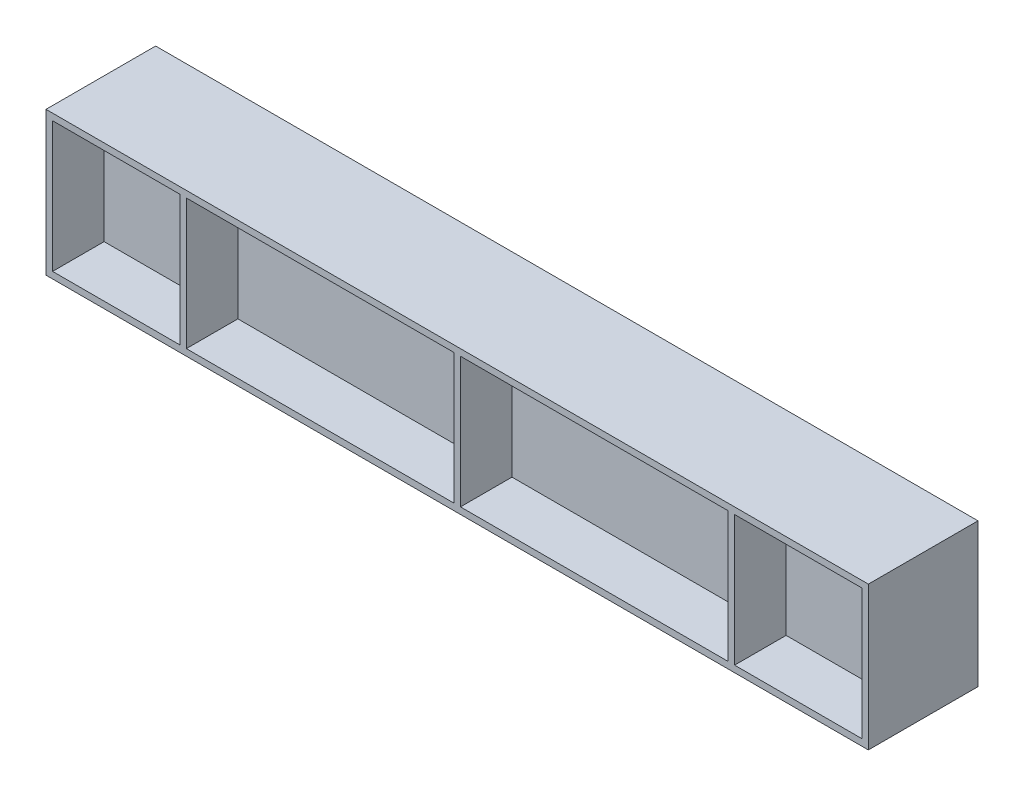
ISO-10303-21;
HEADER;
FILE_DESCRIPTION(('STEP AP214'),'2;1');
FILE_NAME('part.step','',(''),(''),'','','');
FILE_SCHEMA(('AUTOMOTIVE_DESIGN { 1 0 10303 214 1 1 1 1 }'));
ENDSEC;
DATA;
#1=APPLICATION_CONTEXT('core data for automotive mechanical design processes');
#2=APPLICATION_PROTOCOL_DEFINITION('international standard','automotive_design',2000,#1);
#3=PRODUCT_CONTEXT('',#1,'mechanical');
#4=PRODUCT('Part','Part','',(#3));
#5=PRODUCT_RELATED_PRODUCT_CATEGORY('part','',(#4));
#6=PRODUCT_DEFINITION_FORMATION('','',#4);
#7=PRODUCT_DEFINITION_CONTEXT('part definition',#1,'design');
#8=PRODUCT_DEFINITION('design','',#6,#7);
#9=PRODUCT_DEFINITION_SHAPE('','',#8);
#10=(LENGTH_UNIT() NAMED_UNIT(*) SI_UNIT(.MILLI.,.METRE.));
#11=(NAMED_UNIT(*) PLANE_ANGLE_UNIT() SI_UNIT($,.RADIAN.));
#12=(NAMED_UNIT(*) SI_UNIT($,.STERADIAN.) SOLID_ANGLE_UNIT());
#13=UNCERTAINTY_MEASURE_WITH_UNIT(LENGTH_MEASURE(1.E-05),#10,'distance_accuracy_value','');
#14=(GEOMETRIC_REPRESENTATION_CONTEXT(3) GLOBAL_UNCERTAINTY_ASSIGNED_CONTEXT((#13)) GLOBAL_UNIT_ASSIGNED_CONTEXT((#10,
#11,#12)) REPRESENTATION_CONTEXT('',''));
#15=CARTESIAN_POINT('',(0.,0.,0.));
#16=DIRECTION('',(0.,0.,1.));
#17=DIRECTION('',(1.,0.,0.));
#18=AXIS2_PLACEMENT_3D('',#15,#16,#17);
#19=CARTESIAN_POINT('',(12.,250.,0.));
#20=DIRECTION('',(-1.,0.,0.));
#21=DIRECTION('',(0.,-1.,0.));
#22=AXIS2_PLACEMENT_3D('',#19,#20,#21);
#23=PLANE('',#22);
#24=DIRECTION('',(0.,0.,1.));
#25=VECTOR('',#24,1.);
#26=CARTESIAN_POINT('',(12.,12.,0.));
#27=LINE('',#26,#25);
#28=CARTESIAN_POINT('',(12.,12.,106.));
#29=VERTEX_POINT('',#28);
#30=CARTESIAN_POINT('',(12.,12.,200.));
#31=VERTEX_POINT('',#30);
#32=EDGE_CURVE('E391',#29,#31,#27,.T.);
#33=ORIENTED_EDGE('',*,*,#32,.F.);
#34=DIRECTION('',(0.,1.,0.));
#35=VECTOR('',#34,1.);
#36=CARTESIAN_POINT('',(12.,250.,106.));
#37=LINE('',#36,#35);
#38=CARTESIAN_POINT('',(12.,250.,106.));
#39=VERTEX_POINT('',#38);
#40=EDGE_CURVE('E47',#29,#39,#37,.T.);
#41=ORIENTED_EDGE('',*,*,#40,.T.);
#42=DIRECTION('',(0.,0.,1.));
#43=VECTOR('',#42,1.);
#44=CARTESIAN_POINT('',(12.,250.,0.));
#45=LINE('',#44,#43);
#46=CARTESIAN_POINT('',(12.,250.,200.));
#47=VERTEX_POINT('',#46);
#48=EDGE_CURVE('E406',#39,#47,#45,.T.);
#49=ORIENTED_EDGE('',*,*,#48,.T.);
#50=DIRECTION('',(0.,-1.,0.));
#51=VECTOR('',#50,1.);
#52=CARTESIAN_POINT('',(12.,250.,200.));
#53=LINE('',#52,#51);
#54=EDGE_CURVE('E365',#47,#31,#53,.T.);
#55=ORIENTED_EDGE('',*,*,#54,.T.);
#56=EDGE_LOOP('',(#33,#41,#49,#55));
#57=FACE_BOUND('',#56,.T.);
#58=ADVANCED_FACE('F32',(#57),#23,.F.);
#59=CARTESIAN_POINT('',(12.,250.,0.));
#60=DIRECTION('',(0.,1.,0.));
#61=DIRECTION('',(0.,0.,1.));
#62=AXIS2_PLACEMENT_3D('',#59,#60,#61);
#63=PLANE('',#62);
#64=ORIENTED_EDGE('',*,*,#48,.F.);
#65=DIRECTION('',(1.,0.,0.));
#66=VECTOR('',#65,1.);
#67=CARTESIAN_POINT('',(12.,250.,106.));
#68=LINE('',#67,#66);
#69=CARTESIAN_POINT('',(244.,250.,106.));
#70=VERTEX_POINT('',#69);
#71=EDGE_CURVE('E549',#39,#70,#68,.T.);
#72=ORIENTED_EDGE('',*,*,#71,.T.);
#73=DIRECTION('',(0.,0.,1.));
#74=VECTOR('',#73,1.);
#75=CARTESIAN_POINT('',(244.,250.,0.));
#76=LINE('',#75,#74);
#77=CARTESIAN_POINT('',(244.,250.,200.));
#78=VERTEX_POINT('',#77);
#79=EDGE_CURVE('E410',#70,#78,#76,.T.);
#80=ORIENTED_EDGE('',*,*,#79,.T.);
#81=DIRECTION('',(-1.,0.,0.));
#82=VECTOR('',#81,1.);
#83=CARTESIAN_POINT('',(12.,250.,200.));
#84=LINE('',#83,#82);
#85=EDGE_CURVE('E382',#78,#47,#84,.T.);
#86=ORIENTED_EDGE('',*,*,#85,.T.);
#87=EDGE_LOOP('',(#64,#72,#80,#86));
#88=FACE_BOUND('',#87,.T.);
#89=ADVANCED_FACE('F481',(#88),#63,.F.);
#90=CARTESIAN_POINT('',(244.,250.,0.));
#91=DIRECTION('',(1.,0.,0.));
#92=DIRECTION('',(0.,1.,0.));
#93=AXIS2_PLACEMENT_3D('',#90,#91,#92);
#94=PLANE('',#93);
#95=ORIENTED_EDGE('',*,*,#79,.F.);
#96=DIRECTION('',(0.,-1.,0.));
#97=VECTOR('',#96,1.);
#98=CARTESIAN_POINT('',(244.,250.,106.));
#99=LINE('',#98,#97);
#100=CARTESIAN_POINT('',(244.,12.,106.));
#101=VERTEX_POINT('',#100);
#102=EDGE_CURVE('E546',#70,#101,#99,.T.);
#103=ORIENTED_EDGE('',*,*,#102,.T.);
#104=DIRECTION('',(0.,0.,1.));
#105=VECTOR('',#104,1.);
#106=CARTESIAN_POINT('',(244.,12.,0.));
#107=LINE('',#106,#105);
#108=CARTESIAN_POINT('',(244.,12.,200.));
#109=VERTEX_POINT('',#108);
#110=EDGE_CURVE('E414',#101,#109,#107,.T.);
#111=ORIENTED_EDGE('',*,*,#110,.T.);
#112=DIRECTION('',(0.,1.,0.));
#113=VECTOR('',#112,1.);
#114=CARTESIAN_POINT('',(244.,250.,200.));
#115=LINE('',#114,#113);
#116=EDGE_CURVE('E397',#109,#78,#115,.T.);
#117=ORIENTED_EDGE('',*,*,#116,.T.);
#118=EDGE_LOOP('',(#95,#103,#111,#117));
#119=FACE_BOUND('',#118,.T.);
#120=ADVANCED_FACE('F486',(#119),#94,.F.);
#121=CARTESIAN_POINT('',(12.,12.,0.));
#122=DIRECTION('',(0.,-1.,0.));
#123=DIRECTION('',(1.,0.,0.));
#124=AXIS2_PLACEMENT_3D('',#121,#122,#123);
#125=PLANE('',#124);
#126=ORIENTED_EDGE('',*,*,#110,.F.);
#127=DIRECTION('',(-1.,0.,0.));
#128=VECTOR('',#127,1.);
#129=CARTESIAN_POINT('',(12.,12.,106.));
#130=LINE('',#129,#128);
#131=EDGE_CURVE('E544',#101,#29,#130,.T.);
#132=ORIENTED_EDGE('',*,*,#131,.T.);
#133=ORIENTED_EDGE('',*,*,#32,.T.);
#134=DIRECTION('',(1.,0.,0.));
#135=VECTOR('',#134,1.);
#136=CARTESIAN_POINT('',(12.,12.,200.));
#137=LINE('',#136,#135);
#138=EDGE_CURVE('E394',#31,#109,#137,.T.);
#139=ORIENTED_EDGE('',*,*,#138,.T.);
#140=EDGE_LOOP('',(#126,#132,#133,#139));
#141=FACE_BOUND('',#140,.T.);
#142=ADVANCED_FACE('F622',(#141),#125,.F.);
#143=CARTESIAN_POINT('',(256.,250.,0.));
#144=DIRECTION('',(-1.,0.,0.));
#145=DIRECTION('',(0.,-1.,0.));
#146=AXIS2_PLACEMENT_3D('',#143,#144,#145);
#147=PLANE('',#146);
#148=DIRECTION('',(0.,0.,1.));
#149=VECTOR('',#148,1.);
#150=CARTESIAN_POINT('',(256.,12.,0.));
#151=LINE('',#150,#149);
#152=CARTESIAN_POINT('',(256.,12.,106.));
#153=VERTEX_POINT('',#152);
#154=CARTESIAN_POINT('',(256.,12.,200.));
#155=VERTEX_POINT('',#154);
#156=EDGE_CURVE('E351',#153,#155,#151,.T.);
#157=ORIENTED_EDGE('',*,*,#156,.F.);
#158=DIRECTION('',(0.,1.,0.));
#159=VECTOR('',#158,1.);
#160=CARTESIAN_POINT('',(256.,250.,106.));
#161=LINE('',#160,#159);
#162=CARTESIAN_POINT('',(256.,250.,106.));
#163=VERTEX_POINT('',#162);
#164=EDGE_CURVE('E541',#153,#163,#161,.T.);
#165=ORIENTED_EDGE('',*,*,#164,.T.);
#166=DIRECTION('',(0.,0.,1.));
#167=VECTOR('',#166,1.);
#168=CARTESIAN_POINT('',(256.,250.,0.));
#169=LINE('',#168,#167);
#170=CARTESIAN_POINT('',(256.,250.,200.));
#171=VERTEX_POINT('',#170);
#172=EDGE_CURVE('E366',#163,#171,#169,.T.);
#173=ORIENTED_EDGE('',*,*,#172,.T.);
#174=DIRECTION('',(0.,-1.,0.));
#175=VECTOR('',#174,1.);
#176=CARTESIAN_POINT('',(256.,250.,200.));
#177=LINE('',#176,#175);
#178=EDGE_CURVE('E325',#171,#155,#177,.T.);
#179=ORIENTED_EDGE('',*,*,#178,.T.);
#180=EDGE_LOOP('',(#157,#165,#173,#179));
#181=FACE_BOUND('',#180,.T.);
#182=ADVANCED_FACE('F628',(#181),#147,.F.);
#183=CARTESIAN_POINT('',(256.,250.,0.));
#184=DIRECTION('',(0.,1.,0.));
#185=DIRECTION('',(0.,0.,1.));
#186=AXIS2_PLACEMENT_3D('',#183,#184,#185);
#187=PLANE('',#186);
#188=ORIENTED_EDGE('',*,*,#172,.F.);
#189=DIRECTION('',(1.,0.,0.));
#190=VECTOR('',#189,1.);
#191=CARTESIAN_POINT('',(256.,250.,106.));
#192=LINE('',#191,#190);
#193=CARTESIAN_POINT('',(744.,250.,106.));
#194=VERTEX_POINT('',#193);
#195=EDGE_CURVE('E538',#163,#194,#192,.T.);
#196=ORIENTED_EDGE('',*,*,#195,.T.);
#197=DIRECTION('',(0.,0.,1.));
#198=VECTOR('',#197,1.);
#199=CARTESIAN_POINT('',(744.,250.,0.));
#200=LINE('',#199,#198);
#201=CARTESIAN_POINT('',(744.,250.,200.));
#202=VERTEX_POINT('',#201);
#203=EDGE_CURVE('E370',#194,#202,#200,.T.);
#204=ORIENTED_EDGE('',*,*,#203,.T.);
#205=DIRECTION('',(-1.,0.,0.));
#206=VECTOR('',#205,1.);
#207=CARTESIAN_POINT('',(256.,250.,200.));
#208=LINE('',#207,#206);
#209=EDGE_CURVE('E342',#202,#171,#208,.T.);
#210=ORIENTED_EDGE('',*,*,#209,.T.);
#211=EDGE_LOOP('',(#188,#196,#204,#210));
#212=FACE_BOUND('',#211,.T.);
#213=ADVANCED_FACE('F724',(#212),#187,.F.);
#214=CARTESIAN_POINT('',(744.,250.,0.));
#215=DIRECTION('',(1.,0.,0.));
#216=DIRECTION('',(0.,0.,-1.));
#217=AXIS2_PLACEMENT_3D('',#214,#215,#216);
#218=PLANE('',#217);
#219=ORIENTED_EDGE('',*,*,#203,.F.);
#220=DIRECTION('',(0.,-1.,0.));
#221=VECTOR('',#220,1.);
#222=CARTESIAN_POINT('',(744.,250.,106.));
#223=LINE('',#222,#221);
#224=CARTESIAN_POINT('',(744.,12.,106.));
#225=VERTEX_POINT('',#224);
#226=EDGE_CURVE('E535',#194,#225,#223,.T.);
#227=ORIENTED_EDGE('',*,*,#226,.T.);
#228=DIRECTION('',(0.,0.,1.));
#229=VECTOR('',#228,1.);
#230=CARTESIAN_POINT('',(744.,12.,0.));
#231=LINE('',#230,#229);
#232=CARTESIAN_POINT('',(744.,12.,200.));
#233=VERTEX_POINT('',#232);
#234=EDGE_CURVE('E374',#225,#233,#231,.T.);
#235=ORIENTED_EDGE('',*,*,#234,.T.);
#236=DIRECTION('',(0.,1.,0.));
#237=VECTOR('',#236,1.);
#238=CARTESIAN_POINT('',(744.,250.,200.));
#239=LINE('',#238,#237);
#240=EDGE_CURVE('E357',#233,#202,#239,.T.);
#241=ORIENTED_EDGE('',*,*,#240,.T.);
#242=EDGE_LOOP('',(#219,#227,#235,#241));
#243=FACE_BOUND('',#242,.T.);
#244=ADVANCED_FACE('F730',(#243),#218,.F.);
#245=CARTESIAN_POINT('',(256.,12.,0.));
#246=DIRECTION('',(0.,-1.,0.));
#247=DIRECTION('',(1.,0.,0.));
#248=AXIS2_PLACEMENT_3D('',#245,#246,#247);
#249=PLANE('',#248);
#250=ORIENTED_EDGE('',*,*,#234,.F.);
#251=DIRECTION('',(-1.,0.,0.));
#252=VECTOR('',#251,1.);
#253=CARTESIAN_POINT('',(256.,12.,106.));
#254=LINE('',#253,#252);
#255=EDGE_CURVE('E532',#225,#153,#254,.T.);
#256=ORIENTED_EDGE('',*,*,#255,.T.);
#257=ORIENTED_EDGE('',*,*,#156,.T.);
#258=DIRECTION('',(1.,0.,0.));
#259=VECTOR('',#258,1.);
#260=CARTESIAN_POINT('',(256.,12.,200.));
#261=LINE('',#260,#259);
#262=EDGE_CURVE('E354',#155,#233,#261,.T.);
#263=ORIENTED_EDGE('',*,*,#262,.T.);
#264=EDGE_LOOP('',(#250,#256,#257,#263));
#265=FACE_BOUND('',#264,.T.);
#266=ADVANCED_FACE('F692',(#265),#249,.F.);
#267=CARTESIAN_POINT('',(756.,250.,0.));
#268=DIRECTION('',(-1.,0.,0.));
#269=DIRECTION('',(0.,0.,1.));
#270=AXIS2_PLACEMENT_3D('',#267,#268,#269);
#271=PLANE('',#270);
#272=DIRECTION('',(0.,0.,1.));
#273=VECTOR('',#272,1.);
#274=CARTESIAN_POINT('',(756.,12.,0.));
#275=LINE('',#274,#273);
#276=CARTESIAN_POINT('',(756.,12.,106.));
#277=VERTEX_POINT('',#276);
#278=CARTESIAN_POINT('',(756.,12.,200.));
#279=VERTEX_POINT('',#278);
#280=EDGE_CURVE('E310',#277,#279,#275,.T.);
#281=ORIENTED_EDGE('',*,*,#280,.F.);
#282=DIRECTION('',(0.,1.,0.));
#283=VECTOR('',#282,1.);
#284=CARTESIAN_POINT('',(756.,250.,106.));
#285=LINE('',#284,#283);
#286=CARTESIAN_POINT('',(756.,250.,106.));
#287=VERTEX_POINT('',#286);
#288=EDGE_CURVE('E529',#277,#287,#285,.T.);
#289=ORIENTED_EDGE('',*,*,#288,.T.);
#290=DIRECTION('',(0.,0.,1.));
#291=VECTOR('',#290,1.);
#292=CARTESIAN_POINT('',(756.,250.,0.));
#293=LINE('',#292,#291);
#294=CARTESIAN_POINT('',(756.,250.,200.));
#295=VERTEX_POINT('',#294);
#296=EDGE_CURVE('E326',#287,#295,#293,.T.);
#297=ORIENTED_EDGE('',*,*,#296,.T.);
#298=DIRECTION('',(0.,-1.,0.));
#299=VECTOR('',#298,1.);
#300=CARTESIAN_POINT('',(756.,250.,200.));
#301=LINE('',#300,#299);
#302=EDGE_CURVE('E311',#295,#279,#301,.T.);
#303=ORIENTED_EDGE('',*,*,#302,.T.);
#304=EDGE_LOOP('',(#281,#289,#297,#303));
#305=FACE_BOUND('',#304,.T.);
#306=ADVANCED_FACE('F672',(#305),#271,.F.);
#307=CARTESIAN_POINT('',(756.,250.,0.));
#308=DIRECTION('',(0.,1.,0.));
#309=DIRECTION('',(0.,0.,1.));
#310=AXIS2_PLACEMENT_3D('',#307,#308,#309);
#311=PLANE('',#310);
#312=ORIENTED_EDGE('',*,*,#296,.F.);
#313=DIRECTION('',(1.,0.,0.));
#314=VECTOR('',#313,1.);
#315=CARTESIAN_POINT('',(756.,250.,106.));
#316=LINE('',#315,#314);
#317=CARTESIAN_POINT('',(1244.,250.,106.));
#318=VERTEX_POINT('',#317);
#319=EDGE_CURVE('E526',#287,#318,#316,.T.);
#320=ORIENTED_EDGE('',*,*,#319,.T.);
#321=DIRECTION('',(0.,0.,1.));
#322=VECTOR('',#321,1.);
#323=CARTESIAN_POINT('',(1244.,250.,0.));
#324=LINE('',#323,#322);
#325=CARTESIAN_POINT('',(1244.,250.,200.));
#326=VERTEX_POINT('',#325);
#327=EDGE_CURVE('E330',#318,#326,#324,.T.);
#328=ORIENTED_EDGE('',*,*,#327,.T.);
#329=DIRECTION('',(-1.,0.,0.));
#330=VECTOR('',#329,1.);
#331=CARTESIAN_POINT('',(756.,250.,200.));
#332=LINE('',#331,#330);
#333=EDGE_CURVE('E301',#326,#295,#332,.T.);
#334=ORIENTED_EDGE('',*,*,#333,.T.);
#335=EDGE_LOOP('',(#312,#320,#328,#334));
#336=FACE_BOUND('',#335,.T.);
#337=ADVANCED_FACE('F682',(#336),#311,.F.);
#338=CARTESIAN_POINT('',(1244.,250.,0.));
#339=DIRECTION('',(1.,0.,0.));
#340=DIRECTION('',(0.,0.,-1.));
#341=AXIS2_PLACEMENT_3D('',#338,#339,#340);
#342=PLANE('',#341);
#343=ORIENTED_EDGE('',*,*,#327,.F.);
#344=DIRECTION('',(0.,-1.,0.));
#345=VECTOR('',#344,1.);
#346=CARTESIAN_POINT('',(1244.,250.,106.));
#347=LINE('',#346,#345);
#348=CARTESIAN_POINT('',(1244.,12.,106.));
#349=VERTEX_POINT('',#348);
#350=EDGE_CURVE('E523',#318,#349,#347,.T.);
#351=ORIENTED_EDGE('',*,*,#350,.T.);
#352=DIRECTION('',(0.,0.,1.));
#353=VECTOR('',#352,1.);
#354=CARTESIAN_POINT('',(1244.,12.,0.));
#355=LINE('',#354,#353);
#356=CARTESIAN_POINT('',(1244.,12.,200.));
#357=VERTEX_POINT('',#356);
#358=EDGE_CURVE('E334',#349,#357,#355,.T.);
#359=ORIENTED_EDGE('',*,*,#358,.T.);
#360=DIRECTION('',(0.,1.,0.));
#361=VECTOR('',#360,1.);
#362=CARTESIAN_POINT('',(1244.,250.,200.));
#363=LINE('',#362,#361);
#364=EDGE_CURVE('E317',#357,#326,#363,.T.);
#365=ORIENTED_EDGE('',*,*,#364,.T.);
#366=EDGE_LOOP('',(#343,#351,#359,#365));
#367=FACE_BOUND('',#366,.T.);
#368=ADVANCED_FACE('F680',(#367),#342,.F.);
#369=CARTESIAN_POINT('',(756.,12.,0.));
#370=DIRECTION('',(0.,-1.,0.));
#371=DIRECTION('',(1.,0.,0.));
#372=AXIS2_PLACEMENT_3D('',#369,#370,#371);
#373=PLANE('',#372);
#374=ORIENTED_EDGE('',*,*,#358,.F.);
#375=DIRECTION('',(-1.,0.,0.));
#376=VECTOR('',#375,1.);
#377=CARTESIAN_POINT('',(756.,12.,106.));
#378=LINE('',#377,#376);
#379=EDGE_CURVE('E520',#349,#277,#378,.T.);
#380=ORIENTED_EDGE('',*,*,#379,.T.);
#381=ORIENTED_EDGE('',*,*,#280,.T.);
#382=DIRECTION('',(1.,0.,0.));
#383=VECTOR('',#382,1.);
#384=CARTESIAN_POINT('',(756.,12.,200.));
#385=LINE('',#384,#383);
#386=EDGE_CURVE('E314',#279,#357,#385,.T.);
#387=ORIENTED_EDGE('',*,*,#386,.T.);
#388=EDGE_LOOP('',(#374,#380,#381,#387));
#389=FACE_BOUND('',#388,.T.);
#390=ADVANCED_FACE('F671',(#389),#373,.F.);
#391=CARTESIAN_POINT('',(1256.,249.999999999999,0.));
#392=DIRECTION('',(-1.,0.,0.));
#393=DIRECTION('',(0.,-1.,0.));
#394=AXIS2_PLACEMENT_3D('',#391,#392,#393);
#395=PLANE('',#394);
#396=DIRECTION('',(0.,0.,1.));
#397=VECTOR('',#396,1.);
#398=CARTESIAN_POINT('',(1256.,11.9999999999998,0.));
#399=LINE('',#398,#397);
#400=CARTESIAN_POINT('',(1256.,11.9999999999998,106.));
#401=VERTEX_POINT('',#400);
#402=CARTESIAN_POINT('',(1256.,11.9999999999997,200.));
#403=VERTEX_POINT('',#402);
#404=EDGE_CURVE('E290',#401,#403,#399,.T.);
#405=ORIENTED_EDGE('',*,*,#404,.F.);
#406=DIRECTION('',(0.,1.,0.));
#407=VECTOR('',#406,1.);
#408=CARTESIAN_POINT('',(1256.,249.999999999999,106.));
#409=LINE('',#408,#407);
#410=CARTESIAN_POINT('',(1256.,249.999999999999,106.));
#411=VERTEX_POINT('',#410);
#412=EDGE_CURVE('E517',#401,#411,#409,.T.);
#413=ORIENTED_EDGE('',*,*,#412,.T.);
#414=DIRECTION('',(0.,0.,1.));
#415=VECTOR('',#414,1.);
#416=CARTESIAN_POINT('',(1256.,249.999999999999,0.));
#417=LINE('',#416,#415);
#418=CARTESIAN_POINT('',(1256.,249.999999999999,200.));
#419=VERTEX_POINT('',#418);
#420=EDGE_CURVE('E573',#411,#419,#417,.T.);
#421=ORIENTED_EDGE('',*,*,#420,.T.);
#422=DIRECTION('',(0.,-1.,0.));
#423=VECTOR('',#422,1.);
#424=CARTESIAN_POINT('',(1256.,249.999999999999,200.));
#425=LINE('',#424,#423);
#426=EDGE_CURVE('E553',#419,#403,#425,.T.);
#427=ORIENTED_EDGE('',*,*,#426,.T.);
#428=EDGE_LOOP('',(#405,#413,#421,#427));
#429=FACE_BOUND('',#428,.T.);
#430=ADVANCED_FACE('F789',(#429),#395,.F.);
#431=CARTESIAN_POINT('',(1256.,249.999999999999,0.));
#432=DIRECTION('',(0.,1.,0.));
#433=DIRECTION('',(0.,0.,1.));
#434=AXIS2_PLACEMENT_3D('',#431,#432,#433);
#435=PLANE('',#434);
#436=ORIENTED_EDGE('',*,*,#420,.F.);
#437=DIRECTION('',(1.,0.,0.));
#438=VECTOR('',#437,1.);
#439=CARTESIAN_POINT('',(1256.,249.999999999999,106.));
#440=LINE('',#439,#438);
#441=CARTESIAN_POINT('',(1488.,249.999999999999,106.));
#442=VERTEX_POINT('',#441);
#443=EDGE_CURVE('E514',#411,#442,#440,.T.);
#444=ORIENTED_EDGE('',*,*,#443,.T.);
#445=DIRECTION('',(0.,0.,1.));
#446=VECTOR('',#445,1.);
#447=CARTESIAN_POINT('',(1488.,249.999999999999,0.));
#448=LINE('',#447,#446);
#449=CARTESIAN_POINT('',(1488.,249.999999999999,200.));
#450=VERTEX_POINT('',#449);
#451=EDGE_CURVE('E576',#442,#450,#448,.T.);
#452=ORIENTED_EDGE('',*,*,#451,.T.);
#453=DIRECTION('',(-1.,0.,0.));
#454=VECTOR('',#453,1.);
#455=CARTESIAN_POINT('',(1256.,249.999999999999,200.));
#456=LINE('',#455,#454);
#457=EDGE_CURVE('E556',#450,#419,#456,.T.);
#458=ORIENTED_EDGE('',*,*,#457,.T.);
#459=EDGE_LOOP('',(#436,#444,#452,#458));
#460=FACE_BOUND('',#459,.T.);
#461=ADVANCED_FACE('F798',(#460),#435,.F.);
#462=CARTESIAN_POINT('',(1488.,249.999999999999,0.));
#463=DIRECTION('',(1.,0.,0.));
#464=DIRECTION('',(0.,0.,-1.));
#465=AXIS2_PLACEMENT_3D('',#462,#463,#464);
#466=PLANE('',#465);
#467=ORIENTED_EDGE('',*,*,#451,.F.);
#468=DIRECTION('',(0.,-1.,0.));
#469=VECTOR('',#468,1.);
#470=CARTESIAN_POINT('',(1488.,249.999999999999,106.));
#471=LINE('',#470,#469);
#472=CARTESIAN_POINT('',(1488.,11.9999999999998,106.));
#473=VERTEX_POINT('',#472);
#474=EDGE_CURVE('E506',#442,#473,#471,.T.);
#475=ORIENTED_EDGE('',*,*,#474,.T.);
#476=DIRECTION('',(0.,0.,1.));
#477=VECTOR('',#476,1.);
#478=CARTESIAN_POINT('',(1488.,11.9999999999998,0.));
#479=LINE('',#478,#477);
#480=CARTESIAN_POINT('',(1488.,11.9999999999998,200.));
#481=VERTEX_POINT('',#480);
#482=EDGE_CURVE('E289',#473,#481,#479,.T.);
#483=ORIENTED_EDGE('',*,*,#482,.T.);
#484=DIRECTION('',(0.,1.,0.));
#485=VECTOR('',#484,1.);
#486=CARTESIAN_POINT('',(1488.,249.999999999999,200.));
#487=LINE('',#486,#485);
#488=EDGE_CURVE('E568',#481,#450,#487,.T.);
#489=ORIENTED_EDGE('',*,*,#488,.T.);
#490=EDGE_LOOP('',(#467,#475,#483,#489));
#491=FACE_BOUND('',#490,.T.);
#492=ADVANCED_FACE('F807',(#491),#466,.F.);
#493=CARTESIAN_POINT('',(1256.,11.9999999999998,0.));
#494=DIRECTION('',(0.,-1.,0.));
#495=DIRECTION('',(0.,0.,-1.));
#496=AXIS2_PLACEMENT_3D('',#493,#494,#495);
#497=PLANE('',#496);
#498=ORIENTED_EDGE('',*,*,#482,.F.);
#499=DIRECTION('',(-1.,0.,0.));
#500=VECTOR('',#499,1.);
#501=CARTESIAN_POINT('',(1256.,11.9999999999998,106.));
#502=LINE('',#501,#500);
#503=EDGE_CURVE('E11',#473,#401,#502,.T.);
#504=ORIENTED_EDGE('',*,*,#503,.T.);
#505=ORIENTED_EDGE('',*,*,#404,.T.);
#506=DIRECTION('',(1.,0.,0.));
#507=VECTOR('',#506,1.);
#508=CARTESIAN_POINT('',(1256.,11.9999999999998,200.));
#509=LINE('',#508,#507);
#510=EDGE_CURVE('E565',#403,#481,#509,.T.);
#511=ORIENTED_EDGE('',*,*,#510,.T.);
#512=EDGE_LOOP('',(#498,#504,#505,#511));
#513=FACE_BOUND('',#512,.T.);
#514=ADVANCED_FACE('F816',(#513),#497,.F.);
#515=CARTESIAN_POINT('',(0.,0.,200.));
#516=DIRECTION('',(1.,0.,0.));
#517=DIRECTION('',(0.,0.,-1.));
#518=AXIS2_PLACEMENT_3D('',#515,#516,#517);
#519=PLANE('',#518);
#520=DIRECTION('',(0.,-1.,0.));
#521=VECTOR('',#520,1.);
#522=CARTESIAN_POINT('',(0.,0.,0.));
#523=LINE('',#522,#521);
#524=CARTESIAN_POINT('',(0.,262.,0.));
#525=VERTEX_POINT('',#524);
#526=CARTESIAN_POINT('',(0.,0.,0.));
#527=VERTEX_POINT('',#526);
#528=EDGE_CURVE('E405',#525,#527,#523,.T.);
#529=ORIENTED_EDGE('',*,*,#528,.T.);
#530=DIRECTION('',(0.,0.,-1.));
#531=VECTOR('',#530,1.);
#532=CARTESIAN_POINT('',(0.,0.,200.));
#533=LINE('',#532,#531);
#534=CARTESIAN_POINT('',(0.,0.,200.));
#535=VERTEX_POINT('',#534);
#536=EDGE_CURVE('E274',#535,#527,#533,.T.);
#537=ORIENTED_EDGE('',*,*,#536,.F.);
#538=DIRECTION('',(0.,-1.,0.));
#539=VECTOR('',#538,1.);
#540=CARTESIAN_POINT('',(0.,0.,200.));
#541=LINE('',#540,#539);
#542=CARTESIAN_POINT('',(0.,262.,200.));
#543=VERTEX_POINT('',#542);
#544=EDGE_CURVE('E418',#543,#535,#541,.T.);
#545=ORIENTED_EDGE('',*,*,#544,.F.);
#546=DIRECTION('',(0.,0.,-1.));
#547=VECTOR('',#546,1.);
#548=CARTESIAN_POINT('',(0.,262.,200.));
#549=LINE('',#548,#547);
#550=EDGE_CURVE('E428',#543,#525,#549,.T.);
#551=ORIENTED_EDGE('',*,*,#550,.T.);
#552=EDGE_LOOP('',(#529,#537,#545,#551));
#553=FACE_BOUND('',#552,.T.);
#554=ADVANCED_FACE('F34',(#553),#519,.F.);
#555=CARTESIAN_POINT('',(0.,0.,200.));
#556=DIRECTION('',(0.,1.,0.));
#557=DIRECTION('',(0.,0.,1.));
#558=AXIS2_PLACEMENT_3D('',#555,#556,#557);
#559=PLANE('',#558);
#560=DIRECTION('',(1.,0.,0.));
#561=VECTOR('',#560,1.);
#562=CARTESIAN_POINT('',(0.,0.,0.));
#563=LINE('',#562,#561);
#564=CARTESIAN_POINT('',(1500.,0.,0.));
#565=VERTEX_POINT('',#564);
#566=EDGE_CURVE('E431',#527,#565,#563,.T.);
#567=ORIENTED_EDGE('',*,*,#566,.T.);
#568=DIRECTION('',(0.,0.,-1.));
#569=VECTOR('',#568,1.);
#570=CARTESIAN_POINT('',(1500.,0.,200.));
#571=LINE('',#570,#569);
#572=CARTESIAN_POINT('',(1500.,0.,200.));
#573=VERTEX_POINT('',#572);
#574=EDGE_CURVE('E442',#573,#565,#571,.T.);
#575=ORIENTED_EDGE('',*,*,#574,.F.);
#576=DIRECTION('',(1.,0.,0.));
#577=VECTOR('',#576,1.);
#578=CARTESIAN_POINT('',(0.,0.,200.));
#579=LINE('',#578,#577);
#580=EDGE_CURVE('E421',#535,#573,#579,.T.);
#581=ORIENTED_EDGE('',*,*,#580,.F.);
#582=ORIENTED_EDGE('',*,*,#536,.T.);
#583=EDGE_LOOP('',(#567,#575,#581,#582));
#584=FACE_BOUND('',#583,.T.);
#585=ADVANCED_FACE('F447',(#584),#559,.F.);
#586=CARTESIAN_POINT('',(1500.,0.,200.));
#587=DIRECTION('',(-1.,0.,0.));
#588=DIRECTION('',(0.,0.,1.));
#589=AXIS2_PLACEMENT_3D('',#586,#587,#588);
#590=PLANE('',#589);
#591=ORIENTED_EDGE('',*,*,#574,.T.);
#592=DIRECTION('',(0.,1.,0.));
#593=VECTOR('',#592,1.);
#594=CARTESIAN_POINT('',(1500.,0.,0.));
#595=LINE('',#594,#593);
#596=CARTESIAN_POINT('',(1500.,262.,0.));
#597=VERTEX_POINT('',#596);
#598=EDGE_CURVE('E434',#565,#597,#595,.T.);
#599=ORIENTED_EDGE('',*,*,#598,.T.);
#600=DIRECTION('',(0.,0.,-1.));
#601=VECTOR('',#600,1.);
#602=CARTESIAN_POINT('',(1500.,262.,200.));
#603=LINE('',#602,#601);
#604=CARTESIAN_POINT('',(1500.,262.,200.));
#605=VERTEX_POINT('',#604);
#606=EDGE_CURVE('E439',#605,#597,#603,.T.);
#607=ORIENTED_EDGE('',*,*,#606,.F.);
#608=DIRECTION('',(0.,1.,0.));
#609=VECTOR('',#608,1.);
#610=CARTESIAN_POINT('',(1500.,0.,200.));
#611=LINE('',#610,#609);
#612=EDGE_CURVE('E424',#573,#605,#611,.T.);
#613=ORIENTED_EDGE('',*,*,#612,.F.);
#614=EDGE_LOOP('',(#591,#599,#607,#613));
#615=FACE_BOUND('',#614,.T.);
#616=ADVANCED_FACE('F463',(#615),#590,.F.);
#617=CARTESIAN_POINT('',(0.,262.,200.));
#618=DIRECTION('',(0.,-1.,0.));
#619=DIRECTION('',(0.,0.,-1.));
#620=AXIS2_PLACEMENT_3D('',#617,#618,#619);
#621=PLANE('',#620);
#622=DIRECTION('',(-1.,0.,0.));
#623=VECTOR('',#622,1.);
#624=CARTESIAN_POINT('',(0.,262.,0.));
#625=LINE('',#624,#623);
#626=EDGE_CURVE('E422',#597,#525,#625,.T.);
#627=ORIENTED_EDGE('',*,*,#626,.T.);
#628=ORIENTED_EDGE('',*,*,#550,.F.);
#629=DIRECTION('',(-1.,0.,0.));
#630=VECTOR('',#629,1.);
#631=CARTESIAN_POINT('',(0.,262.,200.));
#632=LINE('',#631,#630);
#633=EDGE_CURVE('E426',#605,#543,#632,.T.);
#634=ORIENTED_EDGE('',*,*,#633,.F.);
#635=ORIENTED_EDGE('',*,*,#606,.T.);
#636=EDGE_LOOP('',(#627,#628,#634,#635));
#637=FACE_BOUND('',#636,.T.);
#638=ADVANCED_FACE('F459',(#637),#621,.F.);
#639=CARTESIAN_POINT('',(0.,262.,200.));
#640=DIRECTION('',(0.,0.,-1.));
#641=DIRECTION('',(-1.,0.,0.));
#642=AXIS2_PLACEMENT_3D('',#639,#640,#641);
#643=PLANE('',#642);
#644=ORIENTED_EDGE('',*,*,#510,.F.);
#645=ORIENTED_EDGE('',*,*,#426,.F.);
#646=ORIENTED_EDGE('',*,*,#457,.F.);
#647=ORIENTED_EDGE('',*,*,#488,.F.);
#648=EDGE_LOOP('',(#644,#645,#646,#647));
#649=FACE_BOUND('',#648,.T.);
#650=ORIENTED_EDGE('',*,*,#386,.F.);
#651=ORIENTED_EDGE('',*,*,#302,.F.);
#652=ORIENTED_EDGE('',*,*,#333,.F.);
#653=ORIENTED_EDGE('',*,*,#364,.F.);
#654=EDGE_LOOP('',(#650,#651,#652,#653));
#655=FACE_BOUND('',#654,.T.);
#656=ORIENTED_EDGE('',*,*,#262,.F.);
#657=ORIENTED_EDGE('',*,*,#178,.F.);
#658=ORIENTED_EDGE('',*,*,#209,.F.);
#659=ORIENTED_EDGE('',*,*,#240,.F.);
#660=EDGE_LOOP('',(#656,#657,#658,#659));
#661=FACE_BOUND('',#660,.T.);
#662=ORIENTED_EDGE('',*,*,#138,.F.);
#663=ORIENTED_EDGE('',*,*,#54,.F.);
#664=ORIENTED_EDGE('',*,*,#85,.F.);
#665=ORIENTED_EDGE('',*,*,#116,.F.);
#666=EDGE_LOOP('',(#662,#663,#664,#665));
#667=FACE_BOUND('',#666,.T.);
#668=ORIENTED_EDGE('',*,*,#544,.T.);
#669=ORIENTED_EDGE('',*,*,#580,.T.);
#670=ORIENTED_EDGE('',*,*,#612,.T.);
#671=ORIENTED_EDGE('',*,*,#633,.T.);
#672=EDGE_LOOP('',(#668,#669,#670,#671));
#673=FACE_BOUND('',#672,.T.);
#674=ADVANCED_FACE('F465',(#649,#655,#661,#667,#673),#643,.F.);
#675=CARTESIAN_POINT('',(0.,262.,0.));
#676=DIRECTION('',(0.,0.,-1.));
#677=DIRECTION('',(-1.,0.,0.));
#678=AXIS2_PLACEMENT_3D('',#675,#676,#677);
#679=PLANE('',#678);
#680=DIRECTION('',(0.,-1.,0.));
#681=VECTOR('',#680,1.);
#682=CARTESIAN_POINT('',(1256.,249.999999999999,0.));
#683=LINE('',#682,#681);
#684=CARTESIAN_POINT('',(1256.,249.999999999999,0.));
#685=VERTEX_POINT('',#684);
#686=CARTESIAN_POINT('',(1256.,11.9999999999998,0.));
#687=VERTEX_POINT('',#686);
#688=EDGE_CURVE('E554',#685,#687,#683,.T.);
#689=ORIENTED_EDGE('',*,*,#688,.T.);
#690=DIRECTION('',(1.,0.,0.));
#691=VECTOR('',#690,1.);
#692=CARTESIAN_POINT('',(1256.,11.9999999999998,0.));
#693=LINE('',#692,#691);
#694=CARTESIAN_POINT('',(1488.,11.9999999999997,0.));
#695=VERTEX_POINT('',#694);
#696=EDGE_CURVE('E287',#687,#695,#693,.T.);
#697=ORIENTED_EDGE('',*,*,#696,.T.);
#698=DIRECTION('',(0.,1.,0.));
#699=VECTOR('',#698,1.);
#700=CARTESIAN_POINT('',(1488.,249.999999999999,0.));
#701=LINE('',#700,#699);
#702=CARTESIAN_POINT('',(1488.,249.999999999999,0.));
#703=VERTEX_POINT('',#702);
#704=EDGE_CURVE('E558',#695,#703,#701,.T.);
#705=ORIENTED_EDGE('',*,*,#704,.T.);
#706=DIRECTION('',(-1.,0.,0.));
#707=VECTOR('',#706,1.);
#708=CARTESIAN_POINT('',(1256.,249.999999999999,0.));
#709=LINE('',#708,#707);
#710=EDGE_CURVE('E294',#703,#685,#709,.T.);
#711=ORIENTED_EDGE('',*,*,#710,.T.);
#712=EDGE_LOOP('',(#689,#697,#705,#711));
#713=FACE_BOUND('',#712,.T.);
#714=DIRECTION('',(0.,-1.,0.));
#715=VECTOR('',#714,1.);
#716=CARTESIAN_POINT('',(756.,250.,0.));
#717=LINE('',#716,#715);
#718=CARTESIAN_POINT('',(756.,250.,0.));
#719=VERTEX_POINT('',#718);
#720=CARTESIAN_POINT('',(756.,12.,0.));
#721=VERTEX_POINT('',#720);
#722=EDGE_CURVE('E297',#719,#721,#717,.T.);
#723=ORIENTED_EDGE('',*,*,#722,.T.);
#724=DIRECTION('',(1.,0.,0.));
#725=VECTOR('',#724,1.);
#726=CARTESIAN_POINT('',(756.,12.,0.));
#727=LINE('',#726,#725);
#728=CARTESIAN_POINT('',(1244.,12.,0.));
#729=VERTEX_POINT('',#728);
#730=EDGE_CURVE('E300',#721,#729,#727,.T.);
#731=ORIENTED_EDGE('',*,*,#730,.T.);
#732=DIRECTION('',(0.,1.,0.));
#733=VECTOR('',#732,1.);
#734=CARTESIAN_POINT('',(1244.,250.,0.));
#735=LINE('',#734,#733);
#736=CARTESIAN_POINT('',(1244.,250.,0.));
#737=VERTEX_POINT('',#736);
#738=EDGE_CURVE('E304',#729,#737,#735,.T.);
#739=ORIENTED_EDGE('',*,*,#738,.T.);
#740=DIRECTION('',(-1.,0.,0.));
#741=VECTOR('',#740,1.);
#742=CARTESIAN_POINT('',(756.,250.,0.));
#743=LINE('',#742,#741);
#744=EDGE_CURVE('E307',#737,#719,#743,.T.);
#745=ORIENTED_EDGE('',*,*,#744,.T.);
#746=EDGE_LOOP('',(#723,#731,#739,#745));
#747=FACE_BOUND('',#746,.T.);
#748=DIRECTION('',(0.,-1.,0.));
#749=VECTOR('',#748,1.);
#750=CARTESIAN_POINT('',(256.,250.,0.));
#751=LINE('',#750,#749);
#752=CARTESIAN_POINT('',(256.,250.,0.));
#753=VERTEX_POINT('',#752);
#754=CARTESIAN_POINT('',(256.,12.,0.));
#755=VERTEX_POINT('',#754);
#756=EDGE_CURVE('E338',#753,#755,#751,.T.);
#757=ORIENTED_EDGE('',*,*,#756,.T.);
#758=DIRECTION('',(1.,0.,0.));
#759=VECTOR('',#758,1.);
#760=CARTESIAN_POINT('',(256.,12.,0.));
#761=LINE('',#760,#759);
#762=CARTESIAN_POINT('',(744.,12.,0.));
#763=VERTEX_POINT('',#762);
#764=EDGE_CURVE('E341',#755,#763,#761,.T.);
#765=ORIENTED_EDGE('',*,*,#764,.T.);
#766=DIRECTION('',(0.,1.,0.));
#767=VECTOR('',#766,1.);
#768=CARTESIAN_POINT('',(744.,250.,0.));
#769=LINE('',#768,#767);
#770=CARTESIAN_POINT('',(744.,250.,0.));
#771=VERTEX_POINT('',#770);
#772=EDGE_CURVE('E345',#763,#771,#769,.T.);
#773=ORIENTED_EDGE('',*,*,#772,.T.);
#774=DIRECTION('',(-1.,0.,0.));
#775=VECTOR('',#774,1.);
#776=CARTESIAN_POINT('',(256.,250.,0.));
#777=LINE('',#776,#775);
#778=EDGE_CURVE('E348',#771,#753,#777,.T.);
#779=ORIENTED_EDGE('',*,*,#778,.T.);
#780=EDGE_LOOP('',(#757,#765,#773,#779));
#781=FACE_BOUND('',#780,.T.);
#782=DIRECTION('',(0.,-1.,0.));
#783=VECTOR('',#782,1.);
#784=CARTESIAN_POINT('',(12.,250.,0.));
#785=LINE('',#784,#783);
#786=CARTESIAN_POINT('',(12.,250.,0.));
#787=VERTEX_POINT('',#786);
#788=CARTESIAN_POINT('',(12.,12.,0.));
#789=VERTEX_POINT('',#788);
#790=EDGE_CURVE('E378',#787,#789,#785,.T.);
#791=ORIENTED_EDGE('',*,*,#790,.T.);
#792=DIRECTION('',(1.,0.,0.));
#793=VECTOR('',#792,1.);
#794=CARTESIAN_POINT('',(12.,12.,0.));
#795=LINE('',#794,#793);
#796=CARTESIAN_POINT('',(244.,12.,0.));
#797=VERTEX_POINT('',#796);
#798=EDGE_CURVE('E381',#789,#797,#795,.T.);
#799=ORIENTED_EDGE('',*,*,#798,.T.);
#800=DIRECTION('',(0.,1.,0.));
#801=VECTOR('',#800,1.);
#802=CARTESIAN_POINT('',(244.,250.,0.));
#803=LINE('',#802,#801);
#804=CARTESIAN_POINT('',(244.,250.,0.));
#805=VERTEX_POINT('',#804);
#806=EDGE_CURVE('E385',#797,#805,#803,.T.);
#807=ORIENTED_EDGE('',*,*,#806,.T.);
#808=DIRECTION('',(-1.,0.,0.));
#809=VECTOR('',#808,1.);
#810=CARTESIAN_POINT('',(12.,250.,0.));
#811=LINE('',#810,#809);
#812=EDGE_CURVE('E388',#805,#787,#811,.T.);
#813=ORIENTED_EDGE('',*,*,#812,.T.);
#814=EDGE_LOOP('',(#791,#799,#807,#813));
#815=FACE_BOUND('',#814,.T.);
#816=ORIENTED_EDGE('',*,*,#528,.F.);
#817=ORIENTED_EDGE('',*,*,#626,.F.);
#818=ORIENTED_EDGE('',*,*,#598,.F.);
#819=ORIENTED_EDGE('',*,*,#566,.F.);
#820=EDGE_LOOP('',(#816,#817,#818,#819));
#821=FACE_BOUND('',#820,.T.);
#822=ADVANCED_FACE('F454',(#713,#747,#781,#815,#821),#679,.T.);
#823=CARTESIAN_POINT('',(12.,250.,94.));
#824=VERTEX_POINT('',#823);
#825=EDGE_CURVE('E402',#787,#824,#45,.T.);
#826=ORIENTED_EDGE('',*,*,#825,.T.);
#827=DIRECTION('',(0.,-1.,0.));
#828=VECTOR('',#827,1.);
#829=CARTESIAN_POINT('',(12.,250.,94.));
#830=LINE('',#829,#828);
#831=CARTESIAN_POINT('',(12.,12.,94.));
#832=VERTEX_POINT('',#831);
#833=EDGE_CURVE('E501',#824,#832,#830,.T.);
#834=ORIENTED_EDGE('',*,*,#833,.T.);
#835=EDGE_CURVE('E415',#789,#832,#27,.T.);
#836=ORIENTED_EDGE('',*,*,#835,.F.);
#837=ORIENTED_EDGE('',*,*,#790,.F.);
#838=EDGE_LOOP('',(#826,#834,#836,#837));
#839=FACE_BOUND('',#838,.T.);
#840=ADVANCED_FACE('F473',(#839),#23,.F.);
#841=CARTESIAN_POINT('',(244.,250.,94.));
#842=VERTEX_POINT('',#841);
#843=EDGE_CURVE('E407',#805,#842,#76,.T.);
#844=ORIENTED_EDGE('',*,*,#843,.T.);
#845=DIRECTION('',(-1.,0.,0.));
#846=VECTOR('',#845,1.);
#847=CARTESIAN_POINT('',(12.,250.,94.));
#848=LINE('',#847,#846);
#849=EDGE_CURVE('E504',#842,#824,#848,.T.);
#850=ORIENTED_EDGE('',*,*,#849,.T.);
#851=ORIENTED_EDGE('',*,*,#825,.F.);
#852=ORIENTED_EDGE('',*,*,#812,.F.);
#853=EDGE_LOOP('',(#844,#850,#851,#852));
#854=FACE_BOUND('',#853,.T.);
#855=ADVANCED_FACE('F489',(#854),#63,.F.);
#856=CARTESIAN_POINT('',(244.,12.,94.));
#857=VERTEX_POINT('',#856);
#858=EDGE_CURVE('E411',#797,#857,#107,.T.);
#859=ORIENTED_EDGE('',*,*,#858,.T.);
#860=DIRECTION('',(0.,1.,0.));
#861=VECTOR('',#860,1.);
#862=CARTESIAN_POINT('',(244.,250.,94.));
#863=LINE('',#862,#861);
#864=EDGE_CURVE('E55',#857,#842,#863,.T.);
#865=ORIENTED_EDGE('',*,*,#864,.T.);
#866=ORIENTED_EDGE('',*,*,#843,.F.);
#867=ORIENTED_EDGE('',*,*,#806,.F.);
#868=EDGE_LOOP('',(#859,#865,#866,#867));
#869=FACE_BOUND('',#868,.T.);
#870=ADVANCED_FACE('F497',(#869),#94,.F.);
#871=ORIENTED_EDGE('',*,*,#835,.T.);
#872=DIRECTION('',(1.,0.,0.));
#873=VECTOR('',#872,1.);
#874=CARTESIAN_POINT('',(12.,12.,94.));
#875=LINE('',#874,#873);
#876=EDGE_CURVE('E508',#832,#857,#875,.T.);
#877=ORIENTED_EDGE('',*,*,#876,.T.);
#878=ORIENTED_EDGE('',*,*,#858,.F.);
#879=ORIENTED_EDGE('',*,*,#798,.F.);
#880=EDGE_LOOP('',(#871,#877,#878,#879));
#881=FACE_BOUND('',#880,.T.);
#882=ADVANCED_FACE('F612',(#881),#125,.F.);
#883=CARTESIAN_POINT('',(256.,250.,94.));
#884=VERTEX_POINT('',#883);
#885=EDGE_CURVE('E362',#753,#884,#169,.T.);
#886=ORIENTED_EDGE('',*,*,#885,.T.);
#887=DIRECTION('',(0.,-1.,0.));
#888=VECTOR('',#887,1.);
#889=CARTESIAN_POINT('',(256.,250.,94.));
#890=LINE('',#889,#888);
#891=CARTESIAN_POINT('',(256.,12.,94.));
#892=VERTEX_POINT('',#891);
#893=EDGE_CURVE('E608',#884,#892,#890,.T.);
#894=ORIENTED_EDGE('',*,*,#893,.T.);
#895=EDGE_CURVE('E375',#755,#892,#151,.T.);
#896=ORIENTED_EDGE('',*,*,#895,.F.);
#897=ORIENTED_EDGE('',*,*,#756,.F.);
#898=EDGE_LOOP('',(#886,#894,#896,#897));
#899=FACE_BOUND('',#898,.T.);
#900=ADVANCED_FACE('F621',(#899),#147,.F.);
#901=CARTESIAN_POINT('',(744.,250.,94.));
#902=VERTEX_POINT('',#901);
#903=EDGE_CURVE('E367',#771,#902,#200,.T.);
#904=ORIENTED_EDGE('',*,*,#903,.T.);
#905=DIRECTION('',(-1.,0.,0.));
#906=VECTOR('',#905,1.);
#907=CARTESIAN_POINT('',(256.,250.,94.));
#908=LINE('',#907,#906);
#909=EDGE_CURVE('E605',#902,#884,#908,.T.);
#910=ORIENTED_EDGE('',*,*,#909,.T.);
#911=ORIENTED_EDGE('',*,*,#885,.F.);
#912=ORIENTED_EDGE('',*,*,#778,.F.);
#913=EDGE_LOOP('',(#904,#910,#911,#912));
#914=FACE_BOUND('',#913,.T.);
#915=ADVANCED_FACE('F721',(#914),#187,.F.);
#916=CARTESIAN_POINT('',(744.,12.,94.));
#917=VERTEX_POINT('',#916);
#918=EDGE_CURVE('E371',#763,#917,#231,.T.);
#919=ORIENTED_EDGE('',*,*,#918,.T.);
#920=DIRECTION('',(0.,1.,0.));
#921=VECTOR('',#920,1.);
#922=CARTESIAN_POINT('',(744.,250.,94.));
#923=LINE('',#922,#921);
#924=EDGE_CURVE('E602',#917,#902,#923,.T.);
#925=ORIENTED_EDGE('',*,*,#924,.T.);
#926=ORIENTED_EDGE('',*,*,#903,.F.);
#927=ORIENTED_EDGE('',*,*,#772,.F.);
#928=EDGE_LOOP('',(#919,#925,#926,#927));
#929=FACE_BOUND('',#928,.T.);
#930=ADVANCED_FACE('F719',(#929),#218,.F.);
#931=ORIENTED_EDGE('',*,*,#895,.T.);
#932=DIRECTION('',(1.,0.,0.));
#933=VECTOR('',#932,1.);
#934=CARTESIAN_POINT('',(256.,12.,94.));
#935=LINE('',#934,#933);
#936=EDGE_CURVE('E599',#892,#917,#935,.T.);
#937=ORIENTED_EDGE('',*,*,#936,.T.);
#938=ORIENTED_EDGE('',*,*,#918,.F.);
#939=ORIENTED_EDGE('',*,*,#764,.F.);
#940=EDGE_LOOP('',(#931,#937,#938,#939));
#941=FACE_BOUND('',#940,.T.);
#942=ADVANCED_FACE('F704',(#941),#249,.F.);
#943=CARTESIAN_POINT('',(756.,250.,94.));
#944=VERTEX_POINT('',#943);
#945=EDGE_CURVE('E322',#719,#944,#293,.T.);
#946=ORIENTED_EDGE('',*,*,#945,.T.);
#947=DIRECTION('',(0.,-1.,0.));
#948=VECTOR('',#947,1.);
#949=CARTESIAN_POINT('',(756.,250.,94.));
#950=LINE('',#949,#948);
#951=CARTESIAN_POINT('',(756.,12.,94.));
#952=VERTEX_POINT('',#951);
#953=EDGE_CURVE('E596',#944,#952,#950,.T.);
#954=ORIENTED_EDGE('',*,*,#953,.T.);
#955=EDGE_CURVE('E335',#721,#952,#275,.T.);
#956=ORIENTED_EDGE('',*,*,#955,.F.);
#957=ORIENTED_EDGE('',*,*,#722,.F.);
#958=EDGE_LOOP('',(#946,#954,#956,#957));
#959=FACE_BOUND('',#958,.T.);
#960=ADVANCED_FACE('F694',(#959),#271,.F.);
#961=CARTESIAN_POINT('',(1244.,250.,94.));
#962=VERTEX_POINT('',#961);
#963=EDGE_CURVE('E327',#737,#962,#324,.T.);
#964=ORIENTED_EDGE('',*,*,#963,.T.);
#965=DIRECTION('',(-1.,0.,0.));
#966=VECTOR('',#965,1.);
#967=CARTESIAN_POINT('',(756.,250.,94.));
#968=LINE('',#967,#966);
#969=EDGE_CURVE('E593',#962,#944,#968,.T.);
#970=ORIENTED_EDGE('',*,*,#969,.T.);
#971=ORIENTED_EDGE('',*,*,#945,.F.);
#972=ORIENTED_EDGE('',*,*,#744,.F.);
#973=EDGE_LOOP('',(#964,#970,#971,#972));
#974=FACE_BOUND('',#973,.T.);
#975=ADVANCED_FACE('F685',(#974),#311,.F.);
#976=CARTESIAN_POINT('',(1244.,12.,94.));
#977=VERTEX_POINT('',#976);
#978=EDGE_CURVE('E331',#729,#977,#355,.T.);
#979=ORIENTED_EDGE('',*,*,#978,.T.);
#980=DIRECTION('',(0.,1.,0.));
#981=VECTOR('',#980,1.);
#982=CARTESIAN_POINT('',(1244.,250.,94.));
#983=LINE('',#982,#981);
#984=EDGE_CURVE('E590',#977,#962,#983,.T.);
#985=ORIENTED_EDGE('',*,*,#984,.T.);
#986=ORIENTED_EDGE('',*,*,#963,.F.);
#987=ORIENTED_EDGE('',*,*,#738,.F.);
#988=EDGE_LOOP('',(#979,#985,#986,#987));
#989=FACE_BOUND('',#988,.T.);
#990=ADVANCED_FACE('F691',(#989),#342,.F.);
#991=ORIENTED_EDGE('',*,*,#955,.T.);
#992=DIRECTION('',(1.,0.,0.));
#993=VECTOR('',#992,1.);
#994=CARTESIAN_POINT('',(756.,12.,94.));
#995=LINE('',#994,#993);
#996=EDGE_CURVE('E282',#952,#977,#995,.T.);
#997=ORIENTED_EDGE('',*,*,#996,.T.);
#998=ORIENTED_EDGE('',*,*,#978,.F.);
#999=ORIENTED_EDGE('',*,*,#730,.F.);
#1000=EDGE_LOOP('',(#991,#997,#998,#999));
#1001=FACE_BOUND('',#1000,.T.);
#1002=ADVANCED_FACE('F702',(#1001),#373,.F.);
#1003=CARTESIAN_POINT('',(1256.,249.999999999999,94.));
#1004=VERTEX_POINT('',#1003);
#1005=EDGE_CURVE('E281',#685,#1004,#417,.T.);
#1006=ORIENTED_EDGE('',*,*,#1005,.T.);
#1007=DIRECTION('',(0.,-1.,0.));
#1008=VECTOR('',#1007,1.);
#1009=CARTESIAN_POINT('',(1256.,249.999999999999,94.));
#1010=LINE('',#1009,#1008);
#1011=CARTESIAN_POINT('',(1256.,11.9999999999998,94.));
#1012=VERTEX_POINT('',#1011);
#1013=EDGE_CURVE('E266',#1004,#1012,#1010,.T.);
#1014=ORIENTED_EDGE('',*,*,#1013,.T.);
#1015=EDGE_CURVE('E279',#687,#1012,#399,.T.);
#1016=ORIENTED_EDGE('',*,*,#1015,.F.);
#1017=ORIENTED_EDGE('',*,*,#688,.F.);
#1018=EDGE_LOOP('',(#1006,#1014,#1016,#1017));
#1019=FACE_BOUND('',#1018,.T.);
#1020=ADVANCED_FACE('F277',(#1019),#395,.F.);
#1021=CARTESIAN_POINT('',(1488.,249.999999999999,94.));
#1022=VERTEX_POINT('',#1021);
#1023=EDGE_CURVE('E574',#703,#1022,#448,.T.);
#1024=ORIENTED_EDGE('',*,*,#1023,.T.);
#1025=DIRECTION('',(-1.,0.,0.));
#1026=VECTOR('',#1025,1.);
#1027=CARTESIAN_POINT('',(1256.,249.999999999999,94.));
#1028=LINE('',#1027,#1026);
#1029=EDGE_CURVE('E283',#1022,#1004,#1028,.T.);
#1030=ORIENTED_EDGE('',*,*,#1029,.T.);
#1031=ORIENTED_EDGE('',*,*,#1005,.F.);
#1032=ORIENTED_EDGE('',*,*,#710,.F.);
#1033=EDGE_LOOP('',(#1024,#1030,#1031,#1032));
#1034=FACE_BOUND('',#1033,.T.);
#1035=ADVANCED_FACE('F584',(#1034),#435,.F.);
#1036=CARTESIAN_POINT('',(1488.,11.9999999999998,94.));
#1037=VERTEX_POINT('',#1036);
#1038=EDGE_CURVE('E292',#695,#1037,#479,.T.);
#1039=ORIENTED_EDGE('',*,*,#1038,.T.);
#1040=DIRECTION('',(0.,1.,0.));
#1041=VECTOR('',#1040,1.);
#1042=CARTESIAN_POINT('',(1488.,249.999999999999,94.));
#1043=LINE('',#1042,#1041);
#1044=EDGE_CURVE('E269',#1037,#1022,#1043,.T.);
#1045=ORIENTED_EDGE('',*,*,#1044,.T.);
#1046=ORIENTED_EDGE('',*,*,#1023,.F.);
#1047=ORIENTED_EDGE('',*,*,#704,.F.);
#1048=EDGE_LOOP('',(#1039,#1045,#1046,#1047));
#1049=FACE_BOUND('',#1048,.T.);
#1050=ADVANCED_FACE('F582',(#1049),#466,.F.);
#1051=ORIENTED_EDGE('',*,*,#1015,.T.);
#1052=DIRECTION('',(1.,0.,0.));
#1053=VECTOR('',#1052,1.);
#1054=CARTESIAN_POINT('',(1256.,11.9999999999998,94.));
#1055=LINE('',#1054,#1053);
#1056=EDGE_CURVE('E40',#1012,#1037,#1055,.T.);
#1057=ORIENTED_EDGE('',*,*,#1056,.T.);
#1058=ORIENTED_EDGE('',*,*,#1038,.F.);
#1059=ORIENTED_EDGE('',*,*,#696,.F.);
#1060=EDGE_LOOP('',(#1051,#1057,#1058,#1059));
#1061=FACE_BOUND('',#1060,.T.);
#1062=ADVANCED_FACE('F285',(#1061),#497,.F.);
#1063=CARTESIAN_POINT('',(0.,260.,94.));
#1064=DIRECTION('',(0.,0.,-1.));
#1065=DIRECTION('',(-1.,0.,0.));
#1066=AXIS2_PLACEMENT_3D('',#1063,#1064,#1065);
#1067=PLANE('',#1066);
#1068=ORIENTED_EDGE('',*,*,#1013,.F.);
#1069=ORIENTED_EDGE('',*,*,#1029,.F.);
#1070=ORIENTED_EDGE('',*,*,#1044,.F.);
#1071=ORIENTED_EDGE('',*,*,#1056,.F.);
#1072=EDGE_LOOP('',(#1068,#1069,#1070,#1071));
#1073=FACE_BOUND('',#1072,.T.);
#1074=ADVANCED_FACE('F265',(#1073),#1067,.T.);
#1075=CARTESIAN_POINT('',(0.,260.,106.));
#1076=DIRECTION('',(0.,0.,1.));
#1077=DIRECTION('',(1.,0.,0.));
#1078=AXIS2_PLACEMENT_3D('',#1075,#1076,#1077);
#1079=PLANE('',#1078);
#1080=ORIENTED_EDGE('',*,*,#412,.F.);
#1081=ORIENTED_EDGE('',*,*,#503,.F.);
#1082=ORIENTED_EDGE('',*,*,#474,.F.);
#1083=ORIENTED_EDGE('',*,*,#443,.F.);
#1084=EDGE_LOOP('',(#1080,#1081,#1082,#1083));
#1085=FACE_BOUND('',#1084,.T.);
#1086=ADVANCED_FACE('F643',(#1085),#1079,.T.);
#1087=ORIENTED_EDGE('',*,*,#953,.F.);
#1088=ORIENTED_EDGE('',*,*,#969,.F.);
#1089=ORIENTED_EDGE('',*,*,#984,.F.);
#1090=ORIENTED_EDGE('',*,*,#996,.F.);
#1091=EDGE_LOOP('',(#1087,#1088,#1089,#1090));
#1092=FACE_BOUND('',#1091,.T.);
#1093=ADVANCED_FACE('F653',(#1092),#1067,.T.);
#1094=ORIENTED_EDGE('',*,*,#288,.F.);
#1095=ORIENTED_EDGE('',*,*,#379,.F.);
#1096=ORIENTED_EDGE('',*,*,#350,.F.);
#1097=ORIENTED_EDGE('',*,*,#319,.F.);
#1098=EDGE_LOOP('',(#1094,#1095,#1096,#1097));
#1099=FACE_BOUND('',#1098,.T.);
#1100=ADVANCED_FACE('F651',(#1099),#1079,.T.);
#1101=ORIENTED_EDGE('',*,*,#893,.F.);
#1102=ORIENTED_EDGE('',*,*,#909,.F.);
#1103=ORIENTED_EDGE('',*,*,#924,.F.);
#1104=ORIENTED_EDGE('',*,*,#936,.F.);
#1105=EDGE_LOOP('',(#1101,#1102,#1103,#1104));
#1106=FACE_BOUND('',#1105,.T.);
#1107=ADVANCED_FACE('F648',(#1106),#1067,.T.);
#1108=ORIENTED_EDGE('',*,*,#164,.F.);
#1109=ORIENTED_EDGE('',*,*,#255,.F.);
#1110=ORIENTED_EDGE('',*,*,#226,.F.);
#1111=ORIENTED_EDGE('',*,*,#195,.F.);
#1112=EDGE_LOOP('',(#1108,#1109,#1110,#1111));
#1113=FACE_BOUND('',#1112,.T.);
#1114=ADVANCED_FACE('F642',(#1113),#1079,.T.);
#1115=ORIENTED_EDGE('',*,*,#833,.F.);
#1116=ORIENTED_EDGE('',*,*,#849,.F.);
#1117=ORIENTED_EDGE('',*,*,#864,.F.);
#1118=ORIENTED_EDGE('',*,*,#876,.F.);
#1119=EDGE_LOOP('',(#1115,#1116,#1117,#1118));
#1120=FACE_BOUND('',#1119,.T.);
#1121=ADVANCED_FACE('F640',(#1120),#1067,.T.);
#1122=ORIENTED_EDGE('',*,*,#40,.F.);
#1123=ORIENTED_EDGE('',*,*,#131,.F.);
#1124=ORIENTED_EDGE('',*,*,#102,.F.);
#1125=ORIENTED_EDGE('',*,*,#71,.F.);
#1126=EDGE_LOOP('',(#1122,#1123,#1124,#1125));
#1127=FACE_BOUND('',#1126,.T.);
#1128=ADVANCED_FACE('F636',(#1127),#1079,.T.);
#1129=CLOSED_SHELL('',(#58,#89,#120,#142,#182,#213,#244,#266,#306,#337,#368,#390,#430,#461,#492,
#514,#554,#585,#616,#638,#674,#822,#840,#855,#870,#882,#900,#915,#930,#942,#960,#975,#990,#1002,
#1020,#1035,#1050,#1062,#1074,#1086,#1093,#1100,#1107,#1114,#1121,#1128));
#1130=MANIFOLD_SOLID_BREP('B2',#1129);
#1131=ADVANCED_BREP_SHAPE_REPRESENTATION('',(#18,#1130),#14);
#1132=SHAPE_DEFINITION_REPRESENTATION(#9,#1131);
ENDSEC;
END-ISO-10303-21;
